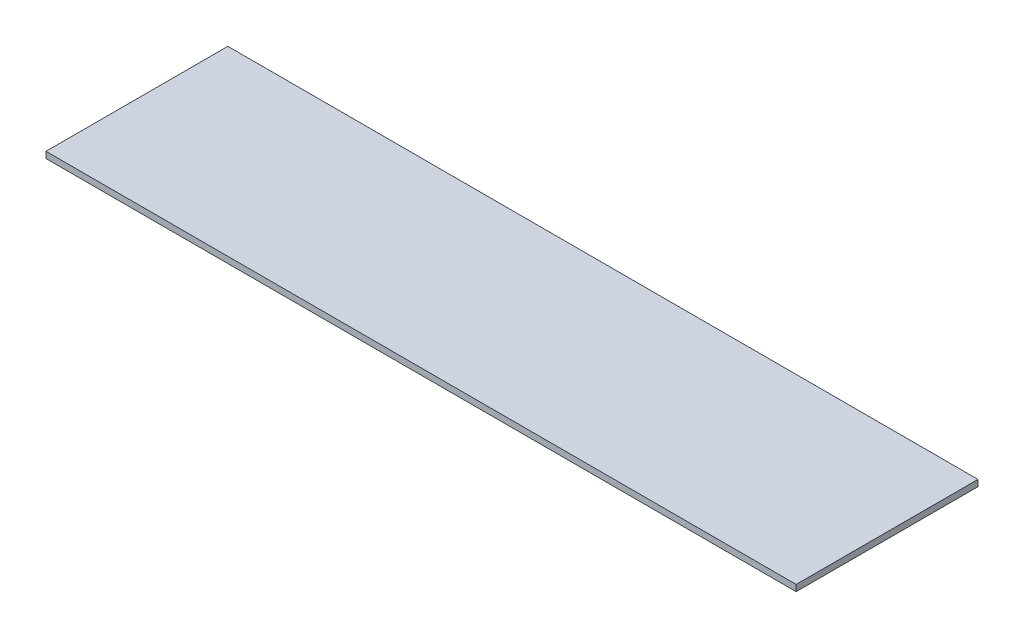
ISO-10303-21;
HEADER;
FILE_DESCRIPTION(('STEP AP214'),'2;1');
FILE_NAME('part.step','',(''),(''),'','','');
FILE_SCHEMA(('AUTOMOTIVE_DESIGN { 1 0 10303 214 1 1 1 1 }'));
ENDSEC;
DATA;
#1=APPLICATION_CONTEXT('core data for automotive mechanical design processes');
#2=APPLICATION_PROTOCOL_DEFINITION('international standard','automotive_design',2000,#1);
#3=PRODUCT_CONTEXT('',#1,'mechanical');
#4=PRODUCT('Part','Part','',(#3));
#5=PRODUCT_RELATED_PRODUCT_CATEGORY('part','',(#4));
#6=PRODUCT_DEFINITION_FORMATION('','',#4);
#7=PRODUCT_DEFINITION_CONTEXT('part definition',#1,'design');
#8=PRODUCT_DEFINITION('design','',#6,#7);
#9=PRODUCT_DEFINITION_SHAPE('','',#8);
#10=(LENGTH_UNIT() NAMED_UNIT(*) SI_UNIT(.MILLI.,.METRE.));
#11=(NAMED_UNIT(*) PLANE_ANGLE_UNIT() SI_UNIT($,.RADIAN.));
#12=(NAMED_UNIT(*) SI_UNIT($,.STERADIAN.) SOLID_ANGLE_UNIT());
#13=UNCERTAINTY_MEASURE_WITH_UNIT(LENGTH_MEASURE(1.E-05),#10,'distance_accuracy_value','');
#14=(GEOMETRIC_REPRESENTATION_CONTEXT(3) GLOBAL_UNCERTAINTY_ASSIGNED_CONTEXT((#13)) GLOBAL_UNIT_ASSIGNED_CONTEXT((#10,
#11,#12)) REPRESENTATION_CONTEXT('',''));
#15=CARTESIAN_POINT('',(0.,0.,0.));
#16=DIRECTION('',(0.,0.,1.));
#17=DIRECTION('',(1.,0.,0.));
#18=AXIS2_PLACEMENT_3D('',#15,#16,#17);
#19=CARTESIAN_POINT('',(0.,5.,0.));
#20=DIRECTION('',(1.,0.,0.));
#21=DIRECTION('',(0.,0.,-1.));
#22=AXIS2_PLACEMENT_3D('',#19,#20,#21);
#23=PLANE('',#22);
#24=DIRECTION('',(0.,0.,1.));
#25=VECTOR('',#24,1.);
#26=CARTESIAN_POINT('',(0.,0.,0.));
#27=LINE('',#26,#25);
#28=CARTESIAN_POINT('',(0.,0.,-144.));
#29=VERTEX_POINT('',#28);
#30=CARTESIAN_POINT('',(0.,0.,0.));
#31=VERTEX_POINT('',#30);
#32=EDGE_CURVE('E95',#29,#31,#27,.T.);
#33=ORIENTED_EDGE('',*,*,#32,.T.);
#34=DIRECTION('',(0.,-1.,0.));
#35=VECTOR('',#34,1.);
#36=CARTESIAN_POINT('',(0.,5.,0.));
#37=LINE('',#36,#35);
#38=CARTESIAN_POINT('',(0.,5.,0.));
#39=VERTEX_POINT('',#38);
#40=EDGE_CURVE('E11',#39,#31,#37,.T.);
#41=ORIENTED_EDGE('',*,*,#40,.F.);
#42=DIRECTION('',(0.,0.,1.));
#43=VECTOR('',#42,1.);
#44=CARTESIAN_POINT('',(0.,5.,0.));
#45=LINE('',#44,#43);
#46=CARTESIAN_POINT('',(0.,5.,-144.));
#47=VERTEX_POINT('',#46);
#48=EDGE_CURVE('E83',#47,#39,#45,.T.);
#49=ORIENTED_EDGE('',*,*,#48,.F.);
#50=DIRECTION('',(0.,-1.,0.));
#51=VECTOR('',#50,1.);
#52=CARTESIAN_POINT('',(0.,5.,-144.));
#53=LINE('',#52,#51);
#54=EDGE_CURVE('E91',#47,#29,#53,.T.);
#55=ORIENTED_EDGE('',*,*,#54,.T.);
#56=EDGE_LOOP('',(#33,#41,#49,#55));
#57=FACE_BOUND('',#56,.T.);
#58=ADVANCED_FACE('F32',(#57),#23,.F.);
#59=CARTESIAN_POINT('',(0.,5.,0.));
#60=DIRECTION('',(0.,0.,-1.));
#61=DIRECTION('',(-1.,0.,0.));
#62=AXIS2_PLACEMENT_3D('',#59,#60,#61);
#63=PLANE('',#62);
#64=DIRECTION('',(1.,0.,0.));
#65=VECTOR('',#64,1.);
#66=CARTESIAN_POINT('',(0.,0.,0.));
#67=LINE('',#66,#65);
#68=CARTESIAN_POINT('',(594.,0.,0.));
#69=VERTEX_POINT('',#68);
#70=EDGE_CURVE('E87',#31,#69,#67,.T.);
#71=ORIENTED_EDGE('',*,*,#70,.T.);
#72=DIRECTION('',(0.,-1.,0.));
#73=VECTOR('',#72,1.);
#74=CARTESIAN_POINT('',(594.,5.,0.));
#75=LINE('',#74,#73);
#76=CARTESIAN_POINT('',(594.,5.,0.));
#77=VERTEX_POINT('',#76);
#78=EDGE_CURVE('E40',#77,#69,#75,.T.);
#79=ORIENTED_EDGE('',*,*,#78,.F.);
#80=DIRECTION('',(1.,0.,0.));
#81=VECTOR('',#80,1.);
#82=CARTESIAN_POINT('',(0.,5.,0.));
#83=LINE('',#82,#81);
#84=EDGE_CURVE('E78',#39,#77,#83,.T.);
#85=ORIENTED_EDGE('',*,*,#84,.F.);
#86=ORIENTED_EDGE('',*,*,#40,.T.);
#87=EDGE_LOOP('',(#71,#79,#85,#86));
#88=FACE_BOUND('',#87,.T.);
#89=ADVANCED_FACE('F86',(#88),#63,.F.);
#90=CARTESIAN_POINT('',(594.,5.,0.));
#91=DIRECTION('',(-1.,0.,0.));
#92=DIRECTION('',(0.,0.,1.));
#93=AXIS2_PLACEMENT_3D('',#90,#91,#92);
#94=PLANE('',#93);
#95=DIRECTION('',(0.,0.,-1.));
#96=VECTOR('',#95,1.);
#97=CARTESIAN_POINT('',(594.,0.,0.));
#98=LINE('',#97,#96);
#99=CARTESIAN_POINT('',(594.,0.,-144.));
#100=VERTEX_POINT('',#99);
#101=EDGE_CURVE('E65',#69,#100,#98,.T.);
#102=ORIENTED_EDGE('',*,*,#101,.T.);
#103=DIRECTION('',(0.,-1.,0.));
#104=VECTOR('',#103,1.);
#105=CARTESIAN_POINT('',(594.,5.,-144.));
#106=LINE('',#105,#104);
#107=CARTESIAN_POINT('',(594.,5.,-144.));
#108=VERTEX_POINT('',#107);
#109=EDGE_CURVE('E88',#108,#100,#106,.T.);
#110=ORIENTED_EDGE('',*,*,#109,.F.);
#111=DIRECTION('',(0.,0.,-1.));
#112=VECTOR('',#111,1.);
#113=CARTESIAN_POINT('',(594.,5.,0.));
#114=LINE('',#113,#112);
#115=EDGE_CURVE('E81',#77,#108,#114,.T.);
#116=ORIENTED_EDGE('',*,*,#115,.F.);
#117=ORIENTED_EDGE('',*,*,#78,.T.);
#118=EDGE_LOOP('',(#102,#110,#116,#117));
#119=FACE_BOUND('',#118,.T.);
#120=ADVANCED_FACE('F89',(#119),#94,.F.);
#121=CARTESIAN_POINT('',(0.,5.,-144.));
#122=DIRECTION('',(0.,0.,1.));
#123=DIRECTION('',(1.,0.,0.));
#124=AXIS2_PLACEMENT_3D('',#121,#122,#123);
#125=PLANE('',#124);
#126=DIRECTION('',(-1.,0.,0.));
#127=VECTOR('',#126,1.);
#128=CARTESIAN_POINT('',(0.,0.,-144.));
#129=LINE('',#128,#127);
#130=EDGE_CURVE('E71',#100,#29,#129,.T.);
#131=ORIENTED_EDGE('',*,*,#130,.T.);
#132=ORIENTED_EDGE('',*,*,#54,.F.);
#133=DIRECTION('',(-1.,0.,0.));
#134=VECTOR('',#133,1.);
#135=CARTESIAN_POINT('',(0.,5.,-144.));
#136=LINE('',#135,#134);
#137=EDGE_CURVE('E48',#108,#47,#136,.T.);
#138=ORIENTED_EDGE('',*,*,#137,.F.);
#139=ORIENTED_EDGE('',*,*,#109,.T.);
#140=EDGE_LOOP('',(#131,#132,#138,#139));
#141=FACE_BOUND('',#140,.T.);
#142=ADVANCED_FACE('F102',(#141),#125,.F.);
#143=CARTESIAN_POINT('',(0.,5.,0.));
#144=DIRECTION('',(0.,-1.,0.));
#145=DIRECTION('',(0.,0.,-1.));
#146=AXIS2_PLACEMENT_3D('',#143,#144,#145);
#147=PLANE('',#146);
#148=ORIENTED_EDGE('',*,*,#48,.T.);
#149=ORIENTED_EDGE('',*,*,#84,.T.);
#150=ORIENTED_EDGE('',*,*,#115,.T.);
#151=ORIENTED_EDGE('',*,*,#137,.T.);
#152=EDGE_LOOP('',(#148,#149,#150,#151));
#153=FACE_BOUND('',#152,.T.);
#154=ADVANCED_FACE('F79',(#153),#147,.F.);
#155=CARTESIAN_POINT('',(0.,0.,0.));
#156=DIRECTION('',(0.,-1.,0.));
#157=DIRECTION('',(0.,0.,-1.));
#158=AXIS2_PLACEMENT_3D('',#155,#156,#157);
#159=PLANE('',#158);
#160=ORIENTED_EDGE('',*,*,#32,.F.);
#161=ORIENTED_EDGE('',*,*,#130,.F.);
#162=ORIENTED_EDGE('',*,*,#101,.F.);
#163=ORIENTED_EDGE('',*,*,#70,.F.);
#164=EDGE_LOOP('',(#160,#161,#162,#163));
#165=FACE_BOUND('',#164,.T.);
#166=ADVANCED_FACE('F105',(#165),#159,.T.);
#167=CLOSED_SHELL('',(#58,#89,#120,#142,#154,#166));
#168=MANIFOLD_SOLID_BREP('B2',#167);
#169=ADVANCED_BREP_SHAPE_REPRESENTATION('',(#18,#168),#14);
#170=SHAPE_DEFINITION_REPRESENTATION(#9,#169);
ENDSEC;
END-ISO-10303-21;
